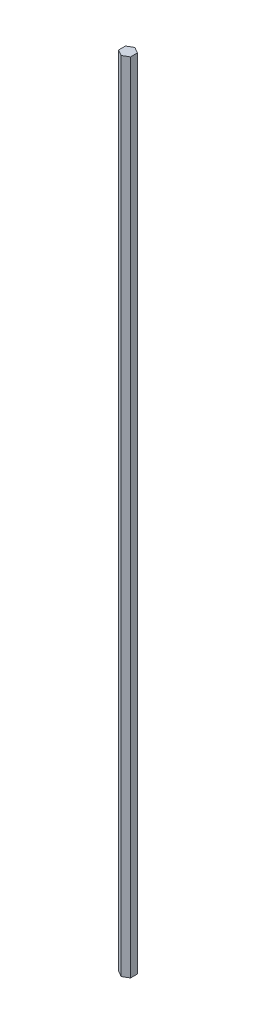
ISO-10303-21;
HEADER;
FILE_DESCRIPTION(('STEP AP214'),'2;1');
FILE_NAME('part.step','',(''),(''),'','','');
FILE_SCHEMA(('AUTOMOTIVE_DESIGN { 1 0 10303 214 1 1 1 1 }'));
ENDSEC;
DATA;
#1=APPLICATION_CONTEXT('core data for automotive mechanical design processes');
#2=APPLICATION_PROTOCOL_DEFINITION('international standard','automotive_design',2000,#1);
#3=PRODUCT_CONTEXT('',#1,'mechanical');
#4=PRODUCT('Part','Part','',(#3));
#5=PRODUCT_RELATED_PRODUCT_CATEGORY('part','',(#4));
#6=PRODUCT_DEFINITION_FORMATION('','',#4);
#7=PRODUCT_DEFINITION_CONTEXT('part definition',#1,'design');
#8=PRODUCT_DEFINITION('design','',#6,#7);
#9=PRODUCT_DEFINITION_SHAPE('','',#8);
#10=(LENGTH_UNIT() NAMED_UNIT(*) SI_UNIT(.MILLI.,.METRE.));
#11=(NAMED_UNIT(*) PLANE_ANGLE_UNIT() SI_UNIT($,.RADIAN.));
#12=(NAMED_UNIT(*) SI_UNIT($,.STERADIAN.) SOLID_ANGLE_UNIT());
#13=UNCERTAINTY_MEASURE_WITH_UNIT(LENGTH_MEASURE(1.E-05),#10,'distance_accuracy_value','');
#14=(GEOMETRIC_REPRESENTATION_CONTEXT(3) GLOBAL_UNCERTAINTY_ASSIGNED_CONTEXT((#13)) GLOBAL_UNIT_ASSIGNED_CONTEXT((#10,
#11,#12)) REPRESENTATION_CONTEXT('',''));
#15=CARTESIAN_POINT('',(0.,0.,0.));
#16=DIRECTION('',(0.,0.,1.));
#17=DIRECTION('',(1.,0.,0.));
#18=AXIS2_PLACEMENT_3D('',#15,#16,#17);
#19=CARTESIAN_POINT('',(7.49999999999999,1000.,-4.3301270189222));
#20=DIRECTION('',(-0.5,0.,0.866025403784439));
#21=DIRECTION('',(0.866025403784439,0.,0.5));
#22=AXIS2_PLACEMENT_3D('',#19,#20,#21);
#23=PLANE('',#22);
#24=DIRECTION('',(-0.866025403784439,0.,-0.5));
#25=VECTOR('',#24,1.);
#26=CARTESIAN_POINT('',(7.49999999999999,0.,-4.3301270189222));
#27=LINE('',#26,#25);
#28=CARTESIAN_POINT('',(7.49999999999999,0.,-4.3301270189222));
#29=VERTEX_POINT('',#28);
#30=CARTESIAN_POINT('',(0.,0.,-8.66025403784438));
#31=VERTEX_POINT('',#30);
#32=EDGE_CURVE('E117',#29,#31,#27,.T.);
#33=ORIENTED_EDGE('',*,*,#32,.T.);
#34=DIRECTION('',(0.,-1.,0.));
#35=VECTOR('',#34,1.);
#36=CARTESIAN_POINT('',(0.,1000.,-8.66025403784438));
#37=LINE('',#36,#35);
#38=CARTESIAN_POINT('',(0.,1000.,-8.66025403784438));
#39=VERTEX_POINT('',#38);
#40=EDGE_CURVE('E11',#39,#31,#37,.T.);
#41=ORIENTED_EDGE('',*,*,#40,.F.);
#42=DIRECTION('',(-0.866025403784439,0.,-0.5));
#43=VECTOR('',#42,1.);
#44=CARTESIAN_POINT('',(7.49999999999999,1000.,-4.3301270189222));
#45=LINE('',#44,#43);
#46=CARTESIAN_POINT('',(7.49999999999999,1000.,-4.3301270189222));
#47=VERTEX_POINT('',#46);
#48=EDGE_CURVE('E127',#47,#39,#45,.T.);
#49=ORIENTED_EDGE('',*,*,#48,.F.);
#50=DIRECTION('',(0.,-1.,0.));
#51=VECTOR('',#50,1.);
#52=CARTESIAN_POINT('',(7.49999999999999,1000.,-4.3301270189222));
#53=LINE('',#52,#51);
#54=EDGE_CURVE('E113',#47,#29,#53,.T.);
#55=ORIENTED_EDGE('',*,*,#54,.T.);
#56=EDGE_LOOP('',(#33,#41,#49,#55));
#57=FACE_BOUND('',#56,.T.);
#58=ADVANCED_FACE('F33',(#57),#23,.F.);
#59=CARTESIAN_POINT('',(0.,1000.,-8.66025403784438));
#60=DIRECTION('',(0.5,0.,0.866025403784439));
#61=DIRECTION('',(0.866025403784438,0.,-0.5));
#62=AXIS2_PLACEMENT_3D('',#59,#60,#61);
#63=PLANE('',#62);
#64=DIRECTION('',(-0.866025403784438,0.,0.5));
#65=VECTOR('',#64,1.);
#66=CARTESIAN_POINT('',(0.,0.,-8.66025403784438));
#67=LINE('',#66,#65);
#68=CARTESIAN_POINT('',(-7.49999999999999,0.,-4.33012701892219));
#69=VERTEX_POINT('',#68);
#70=EDGE_CURVE('E120',#31,#69,#67,.T.);
#71=ORIENTED_EDGE('',*,*,#70,.T.);
#72=DIRECTION('',(0.,-1.,0.));
#73=VECTOR('',#72,1.);
#74=CARTESIAN_POINT('',(-7.49999999999999,1000.,-4.33012701892219));
#75=LINE('',#74,#73);
#76=CARTESIAN_POINT('',(-7.49999999999999,1000.,-4.33012701892219));
#77=VERTEX_POINT('',#76);
#78=EDGE_CURVE('E41',#77,#69,#75,.T.);
#79=ORIENTED_EDGE('',*,*,#78,.F.);
#80=DIRECTION('',(-0.866025403784438,0.,0.5));
#81=VECTOR('',#80,1.);
#82=CARTESIAN_POINT('',(0.,1000.,-8.66025403784438));
#83=LINE('',#82,#81);
#84=EDGE_CURVE('E86',#39,#77,#83,.T.);
#85=ORIENTED_EDGE('',*,*,#84,.F.);
#86=ORIENTED_EDGE('',*,*,#40,.T.);
#87=EDGE_LOOP('',(#71,#79,#85,#86));
#88=FACE_BOUND('',#87,.T.);
#89=ADVANCED_FACE('F151',(#88),#63,.F.);
#90=CARTESIAN_POINT('',(-7.49999999999999,1000.,-4.33012701892219));
#91=DIRECTION('',(1.,0.,0.));
#92=DIRECTION('',(0.,0.,-1.));
#93=AXIS2_PLACEMENT_3D('',#90,#91,#92);
#94=PLANE('',#93);
#95=DIRECTION('',(0.,0.,1.));
#96=VECTOR('',#95,1.);
#97=CARTESIAN_POINT('',(-7.49999999999999,0.,-4.33012701892219));
#98=LINE('',#97,#96);
#99=CARTESIAN_POINT('',(-7.49999999999999,0.,4.3301270189222));
#100=VERTEX_POINT('',#99);
#101=EDGE_CURVE('E122',#69,#100,#98,.T.);
#102=ORIENTED_EDGE('',*,*,#101,.T.);
#103=DIRECTION('',(0.,-1.,0.));
#104=VECTOR('',#103,1.);
#105=CARTESIAN_POINT('',(-7.49999999999999,1000.,4.3301270189222));
#106=LINE('',#105,#104);
#107=CARTESIAN_POINT('',(-7.49999999999999,1000.,4.3301270189222));
#108=VERTEX_POINT('',#107);
#109=EDGE_CURVE('E108',#108,#100,#106,.T.);
#110=ORIENTED_EDGE('',*,*,#109,.F.);
#111=DIRECTION('',(0.,0.,1.));
#112=VECTOR('',#111,1.);
#113=CARTESIAN_POINT('',(-7.49999999999999,1000.,-4.33012701892219));
#114=LINE('',#113,#112);
#115=EDGE_CURVE('E99',#77,#108,#114,.T.);
#116=ORIENTED_EDGE('',*,*,#115,.F.);
#117=ORIENTED_EDGE('',*,*,#78,.T.);
#118=EDGE_LOOP('',(#102,#110,#116,#117));
#119=FACE_BOUND('',#118,.T.);
#120=ADVANCED_FACE('F133',(#119),#94,.F.);
#121=CARTESIAN_POINT('',(-7.49999999999999,1000.,4.3301270189222));
#122=DIRECTION('',(0.5,0.,-0.866025403784439));
#123=DIRECTION('',(-0.866025403784438,0.,-0.5));
#124=AXIS2_PLACEMENT_3D('',#121,#122,#123);
#125=PLANE('',#124);
#126=DIRECTION('',(0.866025403784438,0.,0.5));
#127=VECTOR('',#126,1.);
#128=CARTESIAN_POINT('',(-7.49999999999999,0.,4.3301270189222));
#129=LINE('',#128,#127);
#130=CARTESIAN_POINT('',(0.,0.,8.66025403784439));
#131=VERTEX_POINT('',#130);
#132=EDGE_CURVE('E107',#100,#131,#129,.T.);
#133=ORIENTED_EDGE('',*,*,#132,.T.);
#134=DIRECTION('',(0.,-1.,0.));
#135=VECTOR('',#134,1.);
#136=CARTESIAN_POINT('',(0.,1000.,8.66025403784439));
#137=LINE('',#136,#135);
#138=CARTESIAN_POINT('',(0.,1000.,8.66025403784439));
#139=VERTEX_POINT('',#138);
#140=EDGE_CURVE('E104',#139,#131,#137,.T.);
#141=ORIENTED_EDGE('',*,*,#140,.F.);
#142=DIRECTION('',(0.866025403784438,0.,0.5));
#143=VECTOR('',#142,1.);
#144=CARTESIAN_POINT('',(-7.49999999999999,1000.,4.3301270189222));
#145=LINE('',#144,#143);
#146=EDGE_CURVE('E93',#108,#139,#145,.T.);
#147=ORIENTED_EDGE('',*,*,#146,.F.);
#148=ORIENTED_EDGE('',*,*,#109,.T.);
#149=EDGE_LOOP('',(#133,#141,#147,#148));
#150=FACE_BOUND('',#149,.T.);
#151=ADVANCED_FACE('F105',(#150),#125,.F.);
#152=CARTESIAN_POINT('',(0.,1000.,8.66025403784439));
#153=DIRECTION('',(-0.5,0.,-0.866025403784439));
#154=DIRECTION('',(-0.866025403784439,0.,0.5));
#155=AXIS2_PLACEMENT_3D('',#152,#153,#154);
#156=PLANE('',#155);
#157=DIRECTION('',(0.866025403784439,0.,-0.5));
#158=VECTOR('',#157,1.);
#159=CARTESIAN_POINT('',(0.,0.,8.66025403784439));
#160=LINE('',#159,#158);
#161=CARTESIAN_POINT('',(7.49999999999999,0.,4.3301270189222));
#162=VERTEX_POINT('',#161);
#163=EDGE_CURVE('E72',#131,#162,#160,.T.);
#164=ORIENTED_EDGE('',*,*,#163,.T.);
#165=DIRECTION('',(0.,-1.,0.));
#166=VECTOR('',#165,1.);
#167=CARTESIAN_POINT('',(7.49999999999999,1000.,4.3301270189222));
#168=LINE('',#167,#166);
#169=CARTESIAN_POINT('',(7.49999999999999,1000.,4.3301270189222));
#170=VERTEX_POINT('',#169);
#171=EDGE_CURVE('E109',#170,#162,#168,.T.);
#172=ORIENTED_EDGE('',*,*,#171,.F.);
#173=DIRECTION('',(0.866025403784439,0.,-0.5));
#174=VECTOR('',#173,1.);
#175=CARTESIAN_POINT('',(0.,1000.,8.66025403784439));
#176=LINE('',#175,#174);
#177=EDGE_CURVE('E97',#139,#170,#176,.T.);
#178=ORIENTED_EDGE('',*,*,#177,.F.);
#179=ORIENTED_EDGE('',*,*,#140,.T.);
#180=EDGE_LOOP('',(#164,#172,#178,#179));
#181=FACE_BOUND('',#180,.T.);
#182=ADVANCED_FACE('F111',(#181),#156,.F.);
#183=CARTESIAN_POINT('',(7.49999999999999,1000.,4.3301270189222));
#184=DIRECTION('',(-1.,0.,0.));
#185=DIRECTION('',(0.,0.,1.));
#186=AXIS2_PLACEMENT_3D('',#183,#184,#185);
#187=PLANE('',#186);
#188=DIRECTION('',(0.,0.,-1.));
#189=VECTOR('',#188,1.);
#190=CARTESIAN_POINT('',(7.49999999999999,0.,4.3301270189222));
#191=LINE('',#190,#189);
#192=EDGE_CURVE('E78',#162,#29,#191,.T.);
#193=ORIENTED_EDGE('',*,*,#192,.T.);
#194=ORIENTED_EDGE('',*,*,#54,.F.);
#195=DIRECTION('',(0.,0.,-1.));
#196=VECTOR('',#195,1.);
#197=CARTESIAN_POINT('',(7.49999999999999,1000.,4.3301270189222));
#198=LINE('',#197,#196);
#199=EDGE_CURVE('E49',#170,#47,#198,.T.);
#200=ORIENTED_EDGE('',*,*,#199,.F.);
#201=ORIENTED_EDGE('',*,*,#171,.T.);
#202=EDGE_LOOP('',(#193,#194,#200,#201));
#203=FACE_BOUND('',#202,.T.);
#204=ADVANCED_FACE('F140',(#203),#187,.F.);
#205=CARTESIAN_POINT('',(0.,1000.,0.));
#206=DIRECTION('',(0.,1.,0.));
#207=DIRECTION('',(0.,0.,1.));
#208=AXIS2_PLACEMENT_3D('',#205,#206,#207);
#209=PLANE('',#208);
#210=ORIENTED_EDGE('',*,*,#48,.T.);
#211=ORIENTED_EDGE('',*,*,#84,.T.);
#212=ORIENTED_EDGE('',*,*,#115,.T.);
#213=ORIENTED_EDGE('',*,*,#146,.T.);
#214=ORIENTED_EDGE('',*,*,#177,.T.);
#215=ORIENTED_EDGE('',*,*,#199,.T.);
#216=EDGE_LOOP('',(#210,#211,#212,#213,#214,#215));
#217=FACE_BOUND('',#216,.T.);
#218=ADVANCED_FACE('F95',(#217),#209,.T.);
#219=CARTESIAN_POINT('',(0.,0.,0.));
#220=DIRECTION('',(0.,1.,0.));
#221=DIRECTION('',(0.,0.,1.));
#222=AXIS2_PLACEMENT_3D('',#219,#220,#221);
#223=PLANE('',#222);
#224=ORIENTED_EDGE('',*,*,#32,.F.);
#225=ORIENTED_EDGE('',*,*,#192,.F.);
#226=ORIENTED_EDGE('',*,*,#163,.F.);
#227=ORIENTED_EDGE('',*,*,#132,.F.);
#228=ORIENTED_EDGE('',*,*,#101,.F.);
#229=ORIENTED_EDGE('',*,*,#70,.F.);
#230=EDGE_LOOP('',(#224,#225,#226,#227,#228,#229));
#231=FACE_BOUND('',#230,.T.);
#232=ADVANCED_FACE('F136',(#231),#223,.F.);
#233=CLOSED_SHELL('',(#58,#89,#120,#151,#182,#204,#218,#232));
#234=MANIFOLD_SOLID_BREP('B2',#233);
#235=ADVANCED_BREP_SHAPE_REPRESENTATION('',(#18,#234),#14);
#236=SHAPE_DEFINITION_REPRESENTATION(#9,#235);
ENDSEC;
END-ISO-10303-21;
